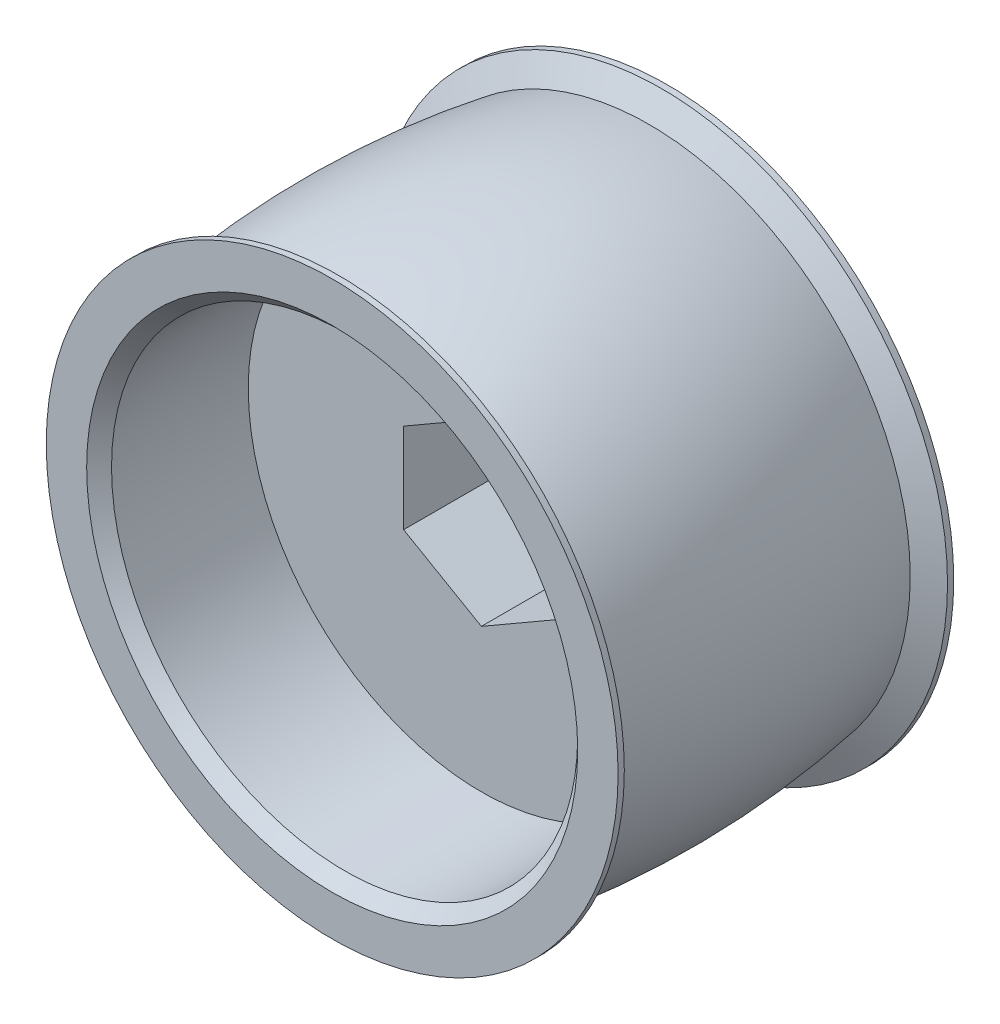
ISO-10303-21;
HEADER;
FILE_DESCRIPTION(('STEP AP214'),'2;1');
FILE_NAME('part.step','',(''),(''),'','','');
FILE_SCHEMA(('AUTOMOTIVE_DESIGN { 1 0 10303 214 1 1 1 1 }'));
ENDSEC;
DATA;
#1=APPLICATION_CONTEXT('core data for automotive mechanical design processes');
#2=APPLICATION_PROTOCOL_DEFINITION('international standard','automotive_design',2000,#1);
#3=PRODUCT_CONTEXT('',#1,'mechanical');
#4=PRODUCT('Part','Part','',(#3));
#5=PRODUCT_RELATED_PRODUCT_CATEGORY('part','',(#4));
#6=PRODUCT_DEFINITION_FORMATION('','',#4);
#7=PRODUCT_DEFINITION_CONTEXT('part definition',#1,'design');
#8=PRODUCT_DEFINITION('design','',#6,#7);
#9=PRODUCT_DEFINITION_SHAPE('','',#8);
#10=(LENGTH_UNIT() NAMED_UNIT(*) SI_UNIT(.MILLI.,.METRE.));
#11=(NAMED_UNIT(*) PLANE_ANGLE_UNIT() SI_UNIT($,.RADIAN.));
#12=(NAMED_UNIT(*) SI_UNIT($,.STERADIAN.) SOLID_ANGLE_UNIT());
#13=UNCERTAINTY_MEASURE_WITH_UNIT(LENGTH_MEASURE(1.E-05),#10,'distance_accuracy_value','');
#14=(GEOMETRIC_REPRESENTATION_CONTEXT(3) GLOBAL_UNCERTAINTY_ASSIGNED_CONTEXT((#13)) GLOBAL_UNIT_ASSIGNED_CONTEXT((#10,
#11,#12)) REPRESENTATION_CONTEXT('',''));
#15=CARTESIAN_POINT('',(0.,0.,0.));
#16=DIRECTION('',(0.,0.,1.));
#17=DIRECTION('',(1.,0.,0.));
#18=AXIS2_PLACEMENT_3D('',#15,#16,#17);
#19=CARTESIAN_POINT('',(0.,0.,15.));
#20=DIRECTION('',(0.,0.,-1.));
#21=DIRECTION('',(-1.,0.,0.));
#22=AXIS2_PLACEMENT_3D('',#19,#20,#21);
#23=CYLINDRICAL_SURFACE('',#22,23.);
#24=CARTESIAN_POINT('',(0.,0.,26.5));
#25=DIRECTION('',(0.,0.,-1.));
#26=DIRECTION('',(-1.,0.,0.));
#27=AXIS2_PLACEMENT_3D('',#24,#25,#26);
#28=CIRCLE('',#27,23.);
#29=CARTESIAN_POINT('',(-23.,0.,26.5));
#30=VERTEX_POINT('',#29);
#31=EDGE_CURVE('E337',#30,#30,#28,.T.);
#32=ORIENTED_EDGE('',*,*,#31,.F.);
#33=EDGE_LOOP('',(#32));
#34=FACE_BOUND('',#33,.T.);
#35=CARTESIAN_POINT('',(0.,0.,27.));
#36=DIRECTION('',(0.,0.,1.));
#37=DIRECTION('',(1.,0.,0.));
#38=AXIS2_PLACEMENT_3D('',#35,#36,#37);
#39=CIRCLE('',#38,23.);
#40=CARTESIAN_POINT('',(23.,0.,27.));
#41=VERTEX_POINT('',#40);
#42=EDGE_CURVE('E139',#41,#41,#39,.T.);
#43=ORIENTED_EDGE('',*,*,#42,.F.);
#44=EDGE_LOOP('',(#43));
#45=FACE_BOUND('',#44,.T.);
#46=ADVANCED_FACE('F37',(#34,#45),#23,.T.);
#47=CARTESIAN_POINT('',(0.,0.,15.));
#48=DIRECTION('',(0.,0.,-1.));
#49=DIRECTION('',(-1.,0.,0.));
#50=AXIS2_PLACEMENT_3D('',#47,#48,#49);
#51=CYLINDRICAL_SURFACE('',#50,2.15);
#52=CARTESIAN_POINT('',(0.,0.,0.));
#53=DIRECTION('',(0.,0.,1.));
#54=DIRECTION('',(1.,0.,0.));
#55=AXIS2_PLACEMENT_3D('',#52,#53,#54);
#56=CIRCLE('',#55,2.15);
#57=CARTESIAN_POINT('',(2.15,0.,0.));
#58=VERTEX_POINT('',#57);
#59=EDGE_CURVE('E142',#58,#58,#56,.T.);
#60=ORIENTED_EDGE('',*,*,#59,.F.);
#61=EDGE_LOOP('',(#60));
#62=FACE_BOUND('',#61,.T.);
#63=CARTESIAN_POINT('',(0.,0.,2.));
#64=DIRECTION('',(0.,0.,1.));
#65=DIRECTION('',(1.,0.,0.));
#66=AXIS2_PLACEMENT_3D('',#63,#64,#65);
#67=CIRCLE('',#66,2.15);
#68=CARTESIAN_POINT('',(2.15,0.,2.));
#69=VERTEX_POINT('',#68);
#70=EDGE_CURVE('E138',#69,#69,#67,.T.);
#71=ORIENTED_EDGE('',*,*,#70,.T.);
#72=EDGE_LOOP('',(#71));
#73=FACE_BOUND('',#72,.T.);
#74=ADVANCED_FACE('F173',(#62,#73),#51,.F.);
#75=CARTESIAN_POINT('',(0.,0.,15.));
#76=DIRECTION('',(0.,0.,1.));
#77=DIRECTION('',(1.,0.,0.));
#78=AXIS2_PLACEMENT_3D('',#75,#76,#77);
#79=PLANE('',#78);
#80=DIRECTION('',(0.866025403784439,0.5,0.));
#81=VECTOR('',#80,1.);
#82=CARTESIAN_POINT('',(0.,-7.21687836487032,15.));
#83=LINE('',#82,#81);
#84=CARTESIAN_POINT('',(0.,-7.21687836487032,15.));
#85=VERTEX_POINT('',#84);
#86=CARTESIAN_POINT('',(6.25,-3.60843918243516,15.));
#87=VERTEX_POINT('',#86);
#88=EDGE_CURVE('E52',#85,#87,#83,.T.);
#89=ORIENTED_EDGE('',*,*,#88,.F.);
#90=DIRECTION('',(0.866025403784439,-0.5,0.));
#91=VECTOR('',#90,1.);
#92=CARTESIAN_POINT('',(-6.25,-3.60843918243516,15.));
#93=LINE('',#92,#91);
#94=CARTESIAN_POINT('',(-6.25,-3.60843918243516,15.));
#95=VERTEX_POINT('',#94);
#96=EDGE_CURVE('E126',#95,#85,#93,.T.);
#97=ORIENTED_EDGE('',*,*,#96,.F.);
#98=DIRECTION('',(0.,-1.,0.));
#99=VECTOR('',#98,1.);
#100=CARTESIAN_POINT('',(-6.25,3.60843918243516,15.));
#101=LINE('',#100,#99);
#102=CARTESIAN_POINT('',(-6.25,3.60843918243516,15.));
#103=VERTEX_POINT('',#102);
#104=EDGE_CURVE('E120',#103,#95,#101,.T.);
#105=ORIENTED_EDGE('',*,*,#104,.F.);
#106=DIRECTION('',(-0.866025403784439,-0.5,0.));
#107=VECTOR('',#106,1.);
#108=CARTESIAN_POINT('',(0.,7.21687836487033,15.));
#109=LINE('',#108,#107);
#110=CARTESIAN_POINT('',(0.,7.21687836487033,15.));
#111=VERTEX_POINT('',#110);
#112=EDGE_CURVE('E118',#111,#103,#109,.T.);
#113=ORIENTED_EDGE('',*,*,#112,.F.);
#114=DIRECTION('',(-0.866025403784439,0.5,0.));
#115=VECTOR('',#114,1.);
#116=CARTESIAN_POINT('',(6.25,3.60843918243516,15.));
#117=LINE('',#116,#115);
#118=CARTESIAN_POINT('',(6.25,3.60843918243516,15.));
#119=VERTEX_POINT('',#118);
#120=EDGE_CURVE('E103',#119,#111,#117,.T.);
#121=ORIENTED_EDGE('',*,*,#120,.F.);
#122=DIRECTION('',(0.,1.,0.));
#123=VECTOR('',#122,1.);
#124=CARTESIAN_POINT('',(6.25,-3.60843918243516,15.));
#125=LINE('',#124,#123);
#126=EDGE_CURVE('E110',#87,#119,#125,.T.);
#127=ORIENTED_EDGE('',*,*,#126,.F.);
#128=EDGE_LOOP('',(#89,#97,#105,#113,#121,#127));
#129=FACE_BOUND('',#128,.T.);
#130=CARTESIAN_POINT('',(0.,0.,15.));
#131=DIRECTION('',(0.,0.,1.));
#132=DIRECTION('',(1.,0.,0.));
#133=AXIS2_PLACEMENT_3D('',#130,#131,#132);
#134=CIRCLE('',#133,18.75);
#135=CARTESIAN_POINT('',(18.75,0.,15.));
#136=VERTEX_POINT('',#135);
#137=EDGE_CURVE('E148',#136,#136,#134,.F.);
#138=ORIENTED_EDGE('',*,*,#137,.F.);
#139=EDGE_LOOP('',(#138));
#140=FACE_BOUND('',#139,.T.);
#141=ADVANCED_FACE('F114',(#129,#140),#79,.T.);
#142=CARTESIAN_POINT('',(0.,0.,0.));
#143=DIRECTION('',(0.,0.,1.));
#144=DIRECTION('',(1.,0.,0.));
#145=AXIS2_PLACEMENT_3D('',#142,#143,#144);
#146=PLANE('',#145);
#147=CARTESIAN_POINT('',(0.,0.,0.));
#148=DIRECTION('',(0.,0.,1.));
#149=DIRECTION('',(1.,0.,0.));
#150=AXIS2_PLACEMENT_3D('',#147,#148,#149);
#151=CIRCLE('',#150,23.);
#152=CARTESIAN_POINT('',(23.,0.,0.));
#153=VERTEX_POINT('',#152);
#154=EDGE_CURVE('E145',#153,#153,#151,.T.);
#155=ORIENTED_EDGE('',*,*,#154,.F.);
#156=EDGE_LOOP('',(#155));
#157=FACE_BOUND('',#156,.T.);
#158=ORIENTED_EDGE('',*,*,#59,.T.);
#159=EDGE_LOOP('',(#158));
#160=FACE_BOUND('',#159,.T.);
#161=ADVANCED_FACE('F186',(#157,#160),#146,.F.);
#162=CARTESIAN_POINT('',(0.,0.,0.5));
#163=DIRECTION('',(0.,0.,-1.));
#164=DIRECTION('',(-1.,0.,0.));
#165=AXIS2_PLACEMENT_3D('',#162,#163,#164);
#166=CIRCLE('',#165,23.);
#167=CARTESIAN_POINT('',(-23.,0.,0.5));
#168=VERTEX_POINT('',#167);
#169=EDGE_CURVE('E198',#168,#168,#166,.T.);
#170=ORIENTED_EDGE('',*,*,#169,.T.);
#171=EDGE_LOOP('',(#170));
#172=FACE_BOUND('',#171,.T.);
#173=ORIENTED_EDGE('',*,*,#154,.T.);
#174=EDGE_LOOP('',(#173));
#175=FACE_BOUND('',#174,.T.);
#176=ADVANCED_FACE('F175',(#172,#175),#23,.T.);
#177=CARTESIAN_POINT('',(0.,0.,27.));
#178=DIRECTION('',(0.,0.,1.));
#179=DIRECTION('',(1.,0.,0.));
#180=AXIS2_PLACEMENT_3D('',#177,#178,#179);
#181=PLANE('',#180);
#182=CARTESIAN_POINT('',(0.,0.,27.));
#183=DIRECTION('',(0.,0.,1.));
#184=DIRECTION('',(1.,0.,0.));
#185=AXIS2_PLACEMENT_3D('',#182,#183,#184);
#186=CIRCLE('',#185,19.75);
#187=CARTESIAN_POINT('',(19.75,0.,27.));
#188=VERTEX_POINT('',#187);
#189=EDGE_CURVE('E12',#188,#188,#186,.F.);
#190=ORIENTED_EDGE('',*,*,#189,.T.);
#191=EDGE_LOOP('',(#190));
#192=FACE_BOUND('',#191,.T.);
#193=ORIENTED_EDGE('',*,*,#42,.T.);
#194=EDGE_LOOP('',(#193));
#195=FACE_BOUND('',#194,.T.);
#196=ADVANCED_FACE('F185',(#192,#195),#181,.T.);
#197=CARTESIAN_POINT('',(0.,0.,27.));
#198=DIRECTION('',(0.,0.,-1.));
#199=DIRECTION('',(-1.,0.,0.));
#200=AXIS2_PLACEMENT_3D('',#197,#198,#199);
#201=CYLINDRICAL_SURFACE('',#200,18.75);
#202=CARTESIAN_POINT('',(0.,0.,26.));
#203=DIRECTION('',(0.,0.,1.));
#204=DIRECTION('',(1.,0.,0.));
#205=AXIS2_PLACEMENT_3D('',#202,#203,#204);
#206=CIRCLE('',#205,18.75);
#207=CARTESIAN_POINT('',(18.75,0.,26.));
#208=VERTEX_POINT('',#207);
#209=EDGE_CURVE('E45',#208,#208,#206,.T.);
#210=ORIENTED_EDGE('',*,*,#209,.T.);
#211=EDGE_LOOP('',(#210));
#212=FACE_BOUND('',#211,.T.);
#213=ORIENTED_EDGE('',*,*,#137,.T.);
#214=EDGE_LOOP('',(#213));
#215=FACE_BOUND('',#214,.T.);
#216=ADVANCED_FACE('F155',(#212,#215),#201,.F.);
#217=CARTESIAN_POINT('',(0.,-7.21687836487032,-19.0940653956493));
#218=DIRECTION('',(0.5,-0.866025403784439,0.));
#219=DIRECTION('',(0.866025403784439,0.5,0.));
#220=AXIS2_PLACEMENT_3D('',#217,#218,#219);
#221=PLANE('',#220);
#222=DIRECTION('',(-0.866025403784439,-0.5,0.));
#223=VECTOR('',#222,1.);
#224=CARTESIAN_POINT('',(0.,-7.21687836487032,2.));
#225=LINE('',#224,#223);
#226=CARTESIAN_POINT('',(6.25,-3.60843918243516,2.));
#227=VERTEX_POINT('',#226);
#228=CARTESIAN_POINT('',(0.,-7.21687836487032,2.));
#229=VERTEX_POINT('',#228);
#230=EDGE_CURVE('E71',#227,#229,#225,.T.);
#231=ORIENTED_EDGE('',*,*,#230,.T.);
#232=DIRECTION('',(0.,0.,1.));
#233=VECTOR('',#232,1.);
#234=CARTESIAN_POINT('',(0.,-7.21687836487032,-19.0940653956493));
#235=LINE('',#234,#233);
#236=EDGE_CURVE('E129',#229,#85,#235,.T.);
#237=ORIENTED_EDGE('',*,*,#236,.T.);
#238=ORIENTED_EDGE('',*,*,#88,.T.);
#239=DIRECTION('',(0.,0.,1.));
#240=VECTOR('',#239,1.);
#241=CARTESIAN_POINT('',(6.25,-3.60843918243516,-19.0940653956493));
#242=LINE('',#241,#240);
#243=EDGE_CURVE('E107',#227,#87,#242,.T.);
#244=ORIENTED_EDGE('',*,*,#243,.F.);
#245=EDGE_LOOP('',(#231,#237,#238,#244));
#246=FACE_BOUND('',#245,.T.);
#247=ADVANCED_FACE('F209',(#246),#221,.F.);
#248=CARTESIAN_POINT('',(-6.25,-3.60843918243516,-19.0940653956493));
#249=DIRECTION('',(-0.5,-0.866025403784439,0.));
#250=DIRECTION('',(0.866025403784439,-0.5,0.));
#251=AXIS2_PLACEMENT_3D('',#248,#249,#250);
#252=PLANE('',#251);
#253=DIRECTION('',(-0.866025403784439,0.5,0.));
#254=VECTOR('',#253,1.);
#255=CARTESIAN_POINT('',(-6.25,-3.60843918243516,2.));
#256=LINE('',#255,#254);
#257=CARTESIAN_POINT('',(-6.25,-3.60843918243516,2.));
#258=VERTEX_POINT('',#257);
#259=EDGE_CURVE('E206',#229,#258,#256,.T.);
#260=ORIENTED_EDGE('',*,*,#259,.T.);
#261=DIRECTION('',(0.,0.,1.));
#262=VECTOR('',#261,1.);
#263=CARTESIAN_POINT('',(-6.25,-3.60843918243516,-19.0940653956493));
#264=LINE('',#263,#262);
#265=EDGE_CURVE('E131',#258,#95,#264,.T.);
#266=ORIENTED_EDGE('',*,*,#265,.T.);
#267=ORIENTED_EDGE('',*,*,#96,.T.);
#268=ORIENTED_EDGE('',*,*,#236,.F.);
#269=EDGE_LOOP('',(#260,#266,#267,#268));
#270=FACE_BOUND('',#269,.T.);
#271=ADVANCED_FACE('F211',(#270),#252,.F.);
#272=CARTESIAN_POINT('',(-6.25,3.60843918243516,-19.0940653956493));
#273=DIRECTION('',(-1.,0.,0.));
#274=DIRECTION('',(0.,-1.,0.));
#275=AXIS2_PLACEMENT_3D('',#272,#273,#274);
#276=PLANE('',#275);
#277=DIRECTION('',(0.,1.,0.));
#278=VECTOR('',#277,1.);
#279=CARTESIAN_POINT('',(-6.25,3.60843918243516,2.));
#280=LINE('',#279,#278);
#281=CARTESIAN_POINT('',(-6.25,3.60843918243516,2.));
#282=VERTEX_POINT('',#281);
#283=EDGE_CURVE('E342',#258,#282,#280,.T.);
#284=ORIENTED_EDGE('',*,*,#283,.T.);
#285=DIRECTION('',(0.,0.,1.));
#286=VECTOR('',#285,1.);
#287=CARTESIAN_POINT('',(-6.25,3.60843918243516,-19.0940653956493));
#288=LINE('',#287,#286);
#289=EDGE_CURVE('E133',#282,#103,#288,.T.);
#290=ORIENTED_EDGE('',*,*,#289,.T.);
#291=ORIENTED_EDGE('',*,*,#104,.T.);
#292=ORIENTED_EDGE('',*,*,#265,.F.);
#293=EDGE_LOOP('',(#284,#290,#291,#292));
#294=FACE_BOUND('',#293,.T.);
#295=ADVANCED_FACE('F217',(#294),#276,.F.);
#296=CARTESIAN_POINT('',(0.,7.21687836487033,-19.0940653956493));
#297=DIRECTION('',(-0.5,0.866025403784439,0.));
#298=DIRECTION('',(-0.866025403784439,-0.5,0.));
#299=AXIS2_PLACEMENT_3D('',#296,#297,#298);
#300=PLANE('',#299);
#301=DIRECTION('',(0.866025403784439,0.5,0.));
#302=VECTOR('',#301,1.);
#303=CARTESIAN_POINT('',(0.,7.21687836487033,2.));
#304=LINE('',#303,#302);
#305=CARTESIAN_POINT('',(0.,7.21687836487032,2.));
#306=VERTEX_POINT('',#305);
#307=EDGE_CURVE('E61',#282,#306,#304,.T.);
#308=ORIENTED_EDGE('',*,*,#307,.T.);
#309=DIRECTION('',(0.,0.,1.));
#310=VECTOR('',#309,1.);
#311=CARTESIAN_POINT('',(0.,7.21687836487033,-19.0940653956493));
#312=LINE('',#311,#310);
#313=EDGE_CURVE('E106',#306,#111,#312,.T.);
#314=ORIENTED_EDGE('',*,*,#313,.T.);
#315=ORIENTED_EDGE('',*,*,#112,.T.);
#316=ORIENTED_EDGE('',*,*,#289,.F.);
#317=EDGE_LOOP('',(#308,#314,#315,#316));
#318=FACE_BOUND('',#317,.T.);
#319=ADVANCED_FACE('F262',(#318),#300,.F.);
#320=CARTESIAN_POINT('',(6.25,3.60843918243516,-19.0940653956493));
#321=DIRECTION('',(0.5,0.866025403784439,0.));
#322=DIRECTION('',(-0.866025403784439,0.5,0.));
#323=AXIS2_PLACEMENT_3D('',#320,#321,#322);
#324=PLANE('',#323);
#325=DIRECTION('',(0.866025403784439,-0.5,0.));
#326=VECTOR('',#325,1.);
#327=CARTESIAN_POINT('',(6.25,3.60843918243516,2.));
#328=LINE('',#327,#326);
#329=CARTESIAN_POINT('',(6.25,3.60843918243516,2.));
#330=VERTEX_POINT('',#329);
#331=EDGE_CURVE('E105',#306,#330,#328,.T.);
#332=ORIENTED_EDGE('',*,*,#331,.T.);
#333=DIRECTION('',(0.,0.,1.));
#334=VECTOR('',#333,1.);
#335=CARTESIAN_POINT('',(6.25,3.60843918243516,-19.0940653956493));
#336=LINE('',#335,#334);
#337=EDGE_CURVE('E98',#330,#119,#336,.T.);
#338=ORIENTED_EDGE('',*,*,#337,.T.);
#339=ORIENTED_EDGE('',*,*,#120,.T.);
#340=ORIENTED_EDGE('',*,*,#313,.F.);
#341=EDGE_LOOP('',(#332,#338,#339,#340));
#342=FACE_BOUND('',#341,.T.);
#343=ADVANCED_FACE('F100',(#342),#324,.F.);
#344=CARTESIAN_POINT('',(6.25,-3.60843918243516,-19.0940653956493));
#345=DIRECTION('',(1.,0.,0.));
#346=DIRECTION('',(0.,1.,0.));
#347=AXIS2_PLACEMENT_3D('',#344,#345,#346);
#348=PLANE('',#347);
#349=DIRECTION('',(0.,-1.,0.));
#350=VECTOR('',#349,1.);
#351=CARTESIAN_POINT('',(6.25,-3.60843918243516,2.));
#352=LINE('',#351,#350);
#353=EDGE_CURVE('E80',#330,#227,#352,.T.);
#354=ORIENTED_EDGE('',*,*,#353,.T.);
#355=ORIENTED_EDGE('',*,*,#243,.T.);
#356=ORIENTED_EDGE('',*,*,#126,.T.);
#357=ORIENTED_EDGE('',*,*,#337,.F.);
#358=EDGE_LOOP('',(#354,#355,#356,#357));
#359=FACE_BOUND('',#358,.T.);
#360=ADVANCED_FACE('F111',(#359),#348,.F.);
#361=CARTESIAN_POINT('',(0.,0.,2.));
#362=DIRECTION('',(0.,0.,1.));
#363=DIRECTION('',(1.,0.,0.));
#364=AXIS2_PLACEMENT_3D('',#361,#362,#363);
#365=PLANE('',#364);
#366=ORIENTED_EDGE('',*,*,#70,.F.);
#367=EDGE_LOOP('',(#366));
#368=FACE_BOUND('',#367,.T.);
#369=ORIENTED_EDGE('',*,*,#230,.F.);
#370=ORIENTED_EDGE('',*,*,#353,.F.);
#371=ORIENTED_EDGE('',*,*,#331,.F.);
#372=ORIENTED_EDGE('',*,*,#307,.F.);
#373=ORIENTED_EDGE('',*,*,#283,.F.);
#374=ORIENTED_EDGE('',*,*,#259,.F.);
#375=EDGE_LOOP('',(#369,#370,#371,#372,#373,#374));
#376=FACE_BOUND('',#375,.T.);
#377=ADVANCED_FACE('F160',(#368,#376),#365,.T.);
#378=CARTESIAN_POINT('',(0.,0.,26.));
#379=DIRECTION('',(0.,0.,1.));
#380=DIRECTION('',(1.,0.,0.));
#381=AXIS2_PLACEMENT_3D('',#378,#379,#380);
#382=CONICAL_SURFACE('',#381,18.75,0.785398163397447);
#383=ORIENTED_EDGE('',*,*,#189,.F.);
#384=EDGE_LOOP('',(#383));
#385=FACE_BOUND('',#384,.T.);
#386=ORIENTED_EDGE('',*,*,#209,.F.);
#387=EDGE_LOOP('',(#386));
#388=FACE_BOUND('',#387,.T.);
#389=ADVANCED_FACE('F39',(#385,#388),#382,.F.);
#390=CARTESIAN_POINT('',(0.,0.,26.5));
#391=DIRECTION('',(0.,0.,1.));
#392=DIRECTION('',(1.,0.,0.));
#393=AXIS2_PLACEMENT_3D('',#390,#391,#392);
#394=CONICAL_SURFACE('',#393,23.,1.10714871779409);
#395=CARTESIAN_POINT('',(0.,0.,25.5));
#396=DIRECTION('',(0.,0.,-1.));
#397=DIRECTION('',(-1.,0.,0.));
#398=AXIS2_PLACEMENT_3D('',#395,#396,#397);
#399=CIRCLE('',#398,21.);
#400=CARTESIAN_POINT('',(-21.,0.,25.5));
#401=VERTEX_POINT('',#400);
#402=EDGE_CURVE('E332',#401,#401,#399,.T.);
#403=ORIENTED_EDGE('',*,*,#402,.F.);
#404=EDGE_LOOP('',(#403));
#405=FACE_BOUND('',#404,.T.);
#406=ORIENTED_EDGE('',*,*,#31,.T.);
#407=EDGE_LOOP('',(#406));
#408=FACE_BOUND('',#407,.T.);
#409=ADVANCED_FACE('F159',(#405,#408),#394,.T.);
#410=CARTESIAN_POINT('',(0.,0.,1.5));
#411=DIRECTION('',(0.,0.,-1.));
#412=DIRECTION('',(-1.,0.,0.));
#413=AXIS2_PLACEMENT_3D('',#410,#411,#412);
#414=CONICAL_SURFACE('',#413,21.,1.10714871779409);
#415=ORIENTED_EDGE('',*,*,#169,.F.);
#416=EDGE_LOOP('',(#415));
#417=FACE_BOUND('',#416,.T.);
#418=CARTESIAN_POINT('',(0.,0.,1.5));
#419=DIRECTION('',(0.,0.,-1.));
#420=DIRECTION('',(-1.,0.,0.));
#421=AXIS2_PLACEMENT_3D('',#418,#419,#420);
#422=CIRCLE('',#421,21.);
#423=CARTESIAN_POINT('',(-21.,0.,1.5));
#424=VERTEX_POINT('',#423);
#425=EDGE_CURVE('E329',#424,#424,#422,.T.);
#426=ORIENTED_EDGE('',*,*,#425,.T.);
#427=EDGE_LOOP('',(#426));
#428=FACE_BOUND('',#427,.T.);
#429=ADVANCED_FACE('F166',(#417,#428),#414,.T.);
#430=CARTESIAN_POINT('',(0.,0.,13.5));
#431=DIRECTION('',(0.,0.,-1.));
#432=DIRECTION('',(-1.,0.,0.));
#433=AXIS2_PLACEMENT_3D('',#430,#431,#432);
#434=DEGENERATE_TOROIDAL_SURFACE('',#433,50.5,72.5000000000001,.F.);
#435=ORIENTED_EDGE('',*,*,#425,.F.);
#436=EDGE_LOOP('',(#435));
#437=FACE_BOUND('',#436,.T.);
#438=ORIENTED_EDGE('',*,*,#402,.T.);
#439=EDGE_LOOP('',(#438));
#440=FACE_BOUND('',#439,.T.);
#441=ADVANCED_FACE('F312',(#437,#440),#434,.F.);
#442=CLOSED_SHELL('',(#46,#74,#141,#161,#176,#196,#216,#247,#271,#295,#319,#343,#360,#377,#389,
#409,#429,#441));
#443=MANIFOLD_SOLID_BREP('B2',#442);
#444=ADVANCED_BREP_SHAPE_REPRESENTATION('',(#18,#443),#14);
#445=SHAPE_DEFINITION_REPRESENTATION(#9,#444);
ENDSEC;
END-ISO-10303-21;
